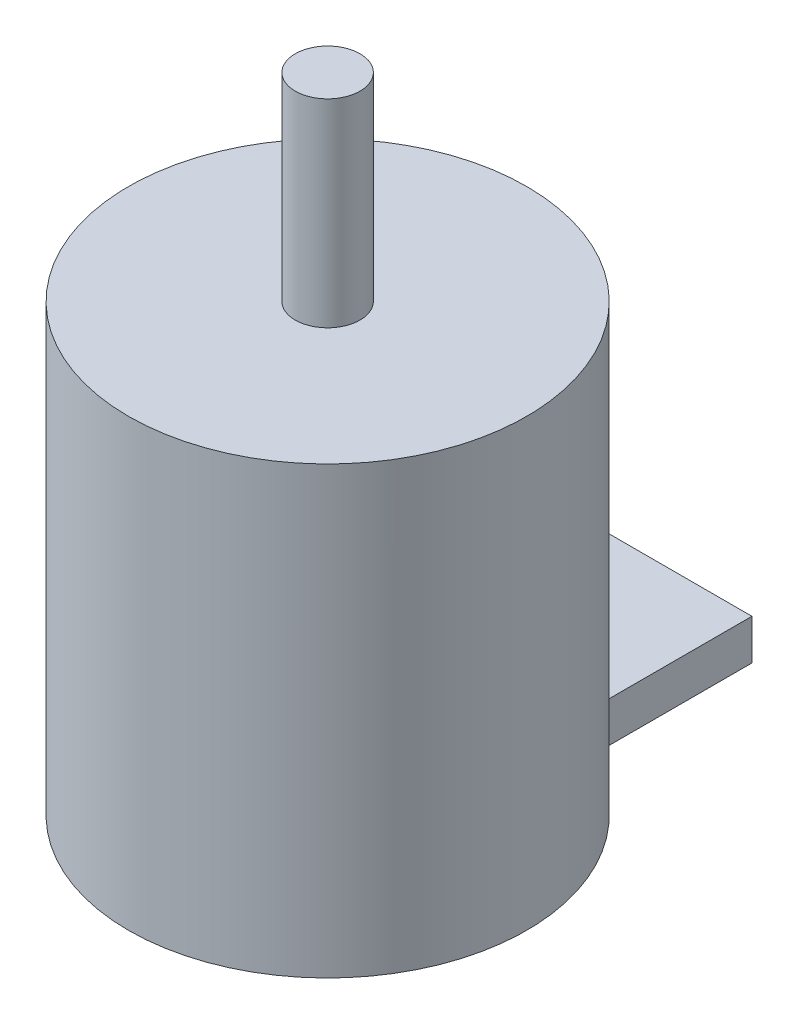
ISO-10303-21;
HEADER;
FILE_DESCRIPTION(('STEP AP214'),'2;1');
FILE_NAME('part.step','',(''),(''),'','','');
FILE_SCHEMA(('AUTOMOTIVE_DESIGN { 1 0 10303 214 1 1 1 1 }'));
ENDSEC;
DATA;
#1=APPLICATION_CONTEXT('core data for automotive mechanical design processes');
#2=APPLICATION_PROTOCOL_DEFINITION('international standard','automotive_design',2000,#1);
#3=PRODUCT_CONTEXT('',#1,'mechanical');
#4=PRODUCT('Part','Part','',(#3));
#5=PRODUCT_RELATED_PRODUCT_CATEGORY('part','',(#4));
#6=PRODUCT_DEFINITION_FORMATION('','',#4);
#7=PRODUCT_DEFINITION_CONTEXT('part definition',#1,'design');
#8=PRODUCT_DEFINITION('design','',#6,#7);
#9=PRODUCT_DEFINITION_SHAPE('','',#8);
#10=(LENGTH_UNIT() NAMED_UNIT(*) SI_UNIT(.MILLI.,.METRE.));
#11=(NAMED_UNIT(*) PLANE_ANGLE_UNIT() SI_UNIT($,.RADIAN.));
#12=(NAMED_UNIT(*) SI_UNIT($,.STERADIAN.) SOLID_ANGLE_UNIT());
#13=UNCERTAINTY_MEASURE_WITH_UNIT(LENGTH_MEASURE(1.E-05),#10,'distance_accuracy_value','');
#14=(GEOMETRIC_REPRESENTATION_CONTEXT(3) GLOBAL_UNCERTAINTY_ASSIGNED_CONTEXT((#13)) GLOBAL_UNIT_ASSIGNED_CONTEXT((#10,
#11,#12)) REPRESENTATION_CONTEXT('',''));
#15=CARTESIAN_POINT('',(0.,0.,0.));
#16=DIRECTION('',(0.,0.,1.));
#17=DIRECTION('',(1.,0.,0.));
#18=AXIS2_PLACEMENT_3D('',#15,#16,#17);
#19=CARTESIAN_POINT('',(0.,55.,0.));
#20=DIRECTION('',(0.,-1.,0.));
#21=DIRECTION('',(0.,0.,-1.));
#22=AXIS2_PLACEMENT_3D('',#19,#20,#21);
#23=CYLINDRICAL_SURFACE('',#22,24.6);
#24=CARTESIAN_POINT('',(0.,55.,0.));
#25=DIRECTION('',(0.,1.,0.));
#26=DIRECTION('',(0.,0.,1.));
#27=AXIS2_PLACEMENT_3D('',#24,#25,#26);
#28=CIRCLE('',#27,24.6);
#29=CARTESIAN_POINT('',(0.,55.,24.6));
#30=VERTEX_POINT('',#29);
#31=EDGE_CURVE('E132',#30,#30,#28,.T.);
#32=ORIENTED_EDGE('',*,*,#31,.F.);
#33=EDGE_LOOP('',(#32));
#34=FACE_BOUND('',#33,.T.);
#35=CARTESIAN_POINT('',(0.,5.,0.));
#36=DIRECTION('',(0.,-1.,0.));
#37=DIRECTION('',(0.,0.,-1.));
#38=AXIS2_PLACEMENT_3D('',#35,#36,#37);
#39=CIRCLE('',#38,24.6);
#40=CARTESIAN_POINT('',(-9.89844609163935,5.,-22.520674167771));
#41=VERTEX_POINT('',#40);
#42=CARTESIAN_POINT('',(9.89844609163936,5.,-22.520674167771));
#43=VERTEX_POINT('',#42);
#44=EDGE_CURVE('E11',#41,#43,#39,.T.);
#45=ORIENTED_EDGE('',*,*,#44,.F.);
#46=DIRECTION('',(0.,-1.,0.));
#47=VECTOR('',#46,1.);
#48=CARTESIAN_POINT('',(-9.89844609163936,5.,-22.520674167771));
#49=LINE('',#48,#47);
#50=CARTESIAN_POINT('',(-9.89844609163936,0.,-22.520674167771));
#51=VERTEX_POINT('',#50);
#52=EDGE_CURVE('E61',#41,#51,#49,.T.);
#53=ORIENTED_EDGE('',*,*,#52,.T.);
#54=CARTESIAN_POINT('',(0.,0.,0.));
#55=DIRECTION('',(0.,1.,0.));
#56=DIRECTION('',(0.,0.,1.));
#57=AXIS2_PLACEMENT_3D('',#54,#55,#56);
#58=CIRCLE('',#57,24.6);
#59=CARTESIAN_POINT('',(9.89844609163936,0.,-22.520674167771));
#60=VERTEX_POINT('',#59);
#61=EDGE_CURVE('E134',#51,#60,#58,.T.);
#62=ORIENTED_EDGE('',*,*,#61,.T.);
#63=DIRECTION('',(0.,-1.,0.));
#64=VECTOR('',#63,1.);
#65=CARTESIAN_POINT('',(9.89844609163936,5.,-22.520674167771));
#66=LINE('',#65,#64);
#67=EDGE_CURVE('E125',#43,#60,#66,.T.);
#68=ORIENTED_EDGE('',*,*,#67,.F.);
#69=EDGE_LOOP('',(#45,#53,#62,#68));
#70=FACE_BOUND('',#69,.T.);
#71=ADVANCED_FACE('F44',(#34,#70),#23,.T.);
#72=CARTESIAN_POINT('',(0.,55.,0.));
#73=DIRECTION('',(0.,1.,0.));
#74=DIRECTION('',(0.,0.,1.));
#75=AXIS2_PLACEMENT_3D('',#72,#73,#74);
#76=PLANE('',#75);
#77=CARTESIAN_POINT('',(0.,55.,0.));
#78=DIRECTION('',(0.,1.,0.));
#79=DIRECTION('',(0.,0.,1.));
#80=AXIS2_PLACEMENT_3D('',#77,#78,#79);
#81=CIRCLE('',#80,4.);
#82=CARTESIAN_POINT('',(0.,55.,4.));
#83=VERTEX_POINT('',#82);
#84=EDGE_CURVE('E52',#83,#83,#81,.T.);
#85=ORIENTED_EDGE('',*,*,#84,.F.);
#86=EDGE_LOOP('',(#85));
#87=FACE_BOUND('',#86,.T.);
#88=ORIENTED_EDGE('',*,*,#31,.T.);
#89=EDGE_LOOP('',(#88));
#90=FACE_BOUND('',#89,.T.);
#91=ADVANCED_FACE('F148',(#87,#90),#76,.T.);
#92=CARTESIAN_POINT('',(0.,0.,0.));
#93=DIRECTION('',(0.,1.,0.));
#94=DIRECTION('',(0.,0.,1.));
#95=AXIS2_PLACEMENT_3D('',#92,#93,#94);
#96=PLANE('',#95);
#97=ORIENTED_EDGE('',*,*,#61,.F.);
#98=DIRECTION('',(0.,0.,-1.));
#99=VECTOR('',#98,1.);
#100=CARTESIAN_POINT('',(-9.89844609163936,0.,-22.520674167771));
#101=LINE('',#100,#99);
#102=CARTESIAN_POINT('',(-9.89844609163935,0.,-42.520674167771));
#103=VERTEX_POINT('',#102);
#104=EDGE_CURVE('E111',#51,#103,#101,.T.);
#105=ORIENTED_EDGE('',*,*,#104,.T.);
#106=DIRECTION('',(1.,0.,0.));
#107=VECTOR('',#106,1.);
#108=CARTESIAN_POINT('',(-9.89844609163935,0.,-42.520674167771));
#109=LINE('',#108,#107);
#110=CARTESIAN_POINT('',(9.89844609163936,0.,-42.520674167771));
#111=VERTEX_POINT('',#110);
#112=EDGE_CURVE('E87',#103,#111,#109,.T.);
#113=ORIENTED_EDGE('',*,*,#112,.T.);
#114=DIRECTION('',(0.,0.,1.));
#115=VECTOR('',#114,1.);
#116=CARTESIAN_POINT('',(9.89844609163936,0.,-22.520674167771));
#117=LINE('',#116,#115);
#118=EDGE_CURVE('E106',#111,#60,#117,.T.);
#119=ORIENTED_EDGE('',*,*,#118,.T.);
#120=EDGE_LOOP('',(#97,#105,#113,#119));
#121=FACE_BOUND('',#120,.T.);
#122=ADVANCED_FACE('F141',(#121),#96,.F.);
#123=CARTESIAN_POINT('',(0.,79.5,0.));
#124=DIRECTION('',(0.,-1.,0.));
#125=DIRECTION('',(0.,0.,-1.));
#126=AXIS2_PLACEMENT_3D('',#123,#124,#125);
#127=CYLINDRICAL_SURFACE('',#126,4.);
#128=CARTESIAN_POINT('',(0.,79.5,0.));
#129=DIRECTION('',(0.,1.,0.));
#130=DIRECTION('',(0.,0.,1.));
#131=AXIS2_PLACEMENT_3D('',#128,#129,#130);
#132=CIRCLE('',#131,4.);
#133=CARTESIAN_POINT('',(0.,79.5,4.));
#134=VERTEX_POINT('',#133);
#135=EDGE_CURVE('E123',#134,#134,#132,.T.);
#136=ORIENTED_EDGE('',*,*,#135,.F.);
#137=EDGE_LOOP('',(#136));
#138=FACE_BOUND('',#137,.T.);
#139=ORIENTED_EDGE('',*,*,#84,.T.);
#140=EDGE_LOOP('',(#139));
#141=FACE_BOUND('',#140,.T.);
#142=ADVANCED_FACE('F144',(#138,#141),#127,.T.);
#143=CARTESIAN_POINT('',(0.,79.5,0.));
#144=DIRECTION('',(0.,1.,0.));
#145=DIRECTION('',(0.,0.,1.));
#146=AXIS2_PLACEMENT_3D('',#143,#144,#145);
#147=PLANE('',#146);
#148=ORIENTED_EDGE('',*,*,#135,.T.);
#149=EDGE_LOOP('',(#148));
#150=FACE_BOUND('',#149,.T.);
#151=ADVANCED_FACE('F155',(#150),#147,.T.);
#152=CARTESIAN_POINT('',(-9.89844609163936,5.,-22.520674167771));
#153=DIRECTION('',(-1.,0.,0.));
#154=DIRECTION('',(0.,0.,1.));
#155=AXIS2_PLACEMENT_3D('',#152,#153,#154);
#156=PLANE('',#155);
#157=ORIENTED_EDGE('',*,*,#104,.F.);
#158=ORIENTED_EDGE('',*,*,#52,.F.);
#159=DIRECTION('',(0.,0.,-1.));
#160=VECTOR('',#159,1.);
#161=CARTESIAN_POINT('',(-9.89844609163936,5.,-22.520674167771));
#162=LINE('',#161,#160);
#163=CARTESIAN_POINT('',(-9.89844609163935,5.,-42.520674167771));
#164=VERTEX_POINT('',#163);
#165=EDGE_CURVE('E99',#41,#164,#162,.T.);
#166=ORIENTED_EDGE('',*,*,#165,.T.);
#167=DIRECTION('',(0.,-1.,0.));
#168=VECTOR('',#167,1.);
#169=CARTESIAN_POINT('',(-9.89844609163935,5.,-42.520674167771));
#170=LINE('',#169,#168);
#171=EDGE_CURVE('E85',#164,#103,#170,.T.);
#172=ORIENTED_EDGE('',*,*,#171,.T.);
#173=EDGE_LOOP('',(#157,#158,#166,#172));
#174=FACE_BOUND('',#173,.T.);
#175=ADVANCED_FACE('F102',(#174),#156,.T.);
#176=CARTESIAN_POINT('',(9.89844609163936,5.,-22.520674167771));
#177=DIRECTION('',(1.,0.,0.));
#178=DIRECTION('',(0.,0.,-1.));
#179=AXIS2_PLACEMENT_3D('',#176,#177,#178);
#180=PLANE('',#179);
#181=ORIENTED_EDGE('',*,*,#118,.F.);
#182=DIRECTION('',(0.,-1.,0.));
#183=VECTOR('',#182,1.);
#184=CARTESIAN_POINT('',(9.89844609163936,5.,-42.520674167771));
#185=LINE('',#184,#183);
#186=CARTESIAN_POINT('',(9.89844609163936,5.,-42.520674167771));
#187=VERTEX_POINT('',#186);
#188=EDGE_CURVE('E91',#187,#111,#185,.T.);
#189=ORIENTED_EDGE('',*,*,#188,.F.);
#190=DIRECTION('',(0.,0.,1.));
#191=VECTOR('',#190,1.);
#192=CARTESIAN_POINT('',(9.89844609163936,5.,-22.520674167771));
#193=LINE('',#192,#191);
#194=EDGE_CURVE('E94',#187,#43,#193,.T.);
#195=ORIENTED_EDGE('',*,*,#194,.T.);
#196=ORIENTED_EDGE('',*,*,#67,.T.);
#197=EDGE_LOOP('',(#181,#189,#195,#196));
#198=FACE_BOUND('',#197,.T.);
#199=ADVANCED_FACE('F142',(#198),#180,.T.);
#200=CARTESIAN_POINT('',(-9.89844609163935,5.,-42.520674167771));
#201=DIRECTION('',(0.,0.,-1.));
#202=DIRECTION('',(-1.,0.,0.));
#203=AXIS2_PLACEMENT_3D('',#200,#201,#202);
#204=PLANE('',#203);
#205=ORIENTED_EDGE('',*,*,#112,.F.);
#206=ORIENTED_EDGE('',*,*,#171,.F.);
#207=DIRECTION('',(1.,0.,0.));
#208=VECTOR('',#207,1.);
#209=CARTESIAN_POINT('',(-9.89844609163935,5.,-42.520674167771));
#210=LINE('',#209,#208);
#211=EDGE_CURVE('E84',#164,#187,#210,.T.);
#212=ORIENTED_EDGE('',*,*,#211,.T.);
#213=ORIENTED_EDGE('',*,*,#188,.T.);
#214=EDGE_LOOP('',(#205,#206,#212,#213));
#215=FACE_BOUND('',#214,.T.);
#216=ADVANCED_FACE('F82',(#215),#204,.T.);
#217=CARTESIAN_POINT('',(0.,5.,0.));
#218=DIRECTION('',(0.,-1.,0.));
#219=DIRECTION('',(0.,0.,-1.));
#220=AXIS2_PLACEMENT_3D('',#217,#218,#219);
#221=PLANE('',#220);
#222=ORIENTED_EDGE('',*,*,#165,.F.);
#223=ORIENTED_EDGE('',*,*,#44,.T.);
#224=ORIENTED_EDGE('',*,*,#194,.F.);
#225=ORIENTED_EDGE('',*,*,#211,.F.);
#226=EDGE_LOOP('',(#222,#223,#224,#225));
#227=FACE_BOUND('',#226,.T.);
#228=ADVANCED_FACE('F97',(#227),#221,.F.);
#229=CLOSED_SHELL('',(#71,#91,#122,#142,#151,#175,#199,#216,#228));
#230=MANIFOLD_SOLID_BREP('B2',#229);
#231=ADVANCED_BREP_SHAPE_REPRESENTATION('',(#18,#230),#14);
#232=SHAPE_DEFINITION_REPRESENTATION(#9,#231);
ENDSEC;
END-ISO-10303-21;
